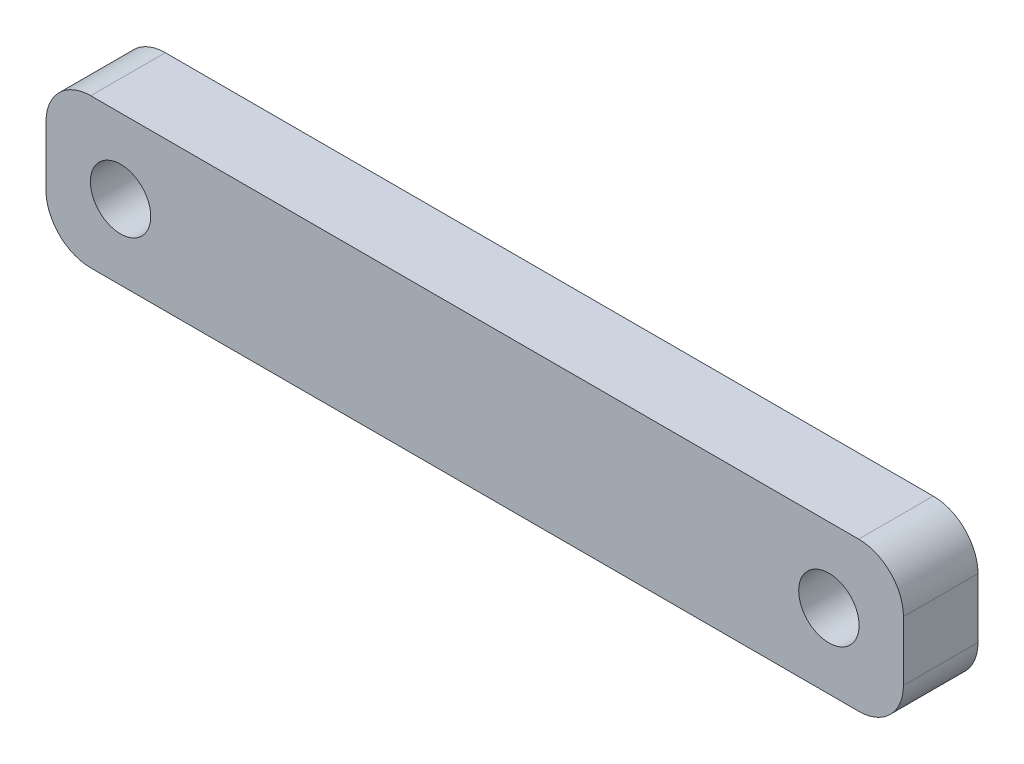
ISO-10303-21;
HEADER;
FILE_DESCRIPTION(('STEP AP214'),'2;1');
FILE_NAME('part.step','',(''),(''),'','','');
FILE_SCHEMA(('AUTOMOTIVE_DESIGN { 1 0 10303 214 1 1 1 1 }'));
ENDSEC;
DATA;
#1=APPLICATION_CONTEXT('core data for automotive mechanical design processes');
#2=APPLICATION_PROTOCOL_DEFINITION('international standard','automotive_design',2000,#1);
#3=PRODUCT_CONTEXT('',#1,'mechanical');
#4=PRODUCT('Part','Part','',(#3));
#5=PRODUCT_RELATED_PRODUCT_CATEGORY('part','',(#4));
#6=PRODUCT_DEFINITION_FORMATION('','',#4);
#7=PRODUCT_DEFINITION_CONTEXT('part definition',#1,'design');
#8=PRODUCT_DEFINITION('design','',#6,#7);
#9=PRODUCT_DEFINITION_SHAPE('','',#8);
#10=(LENGTH_UNIT() NAMED_UNIT(*) SI_UNIT(.MILLI.,.METRE.));
#11=(NAMED_UNIT(*) PLANE_ANGLE_UNIT() SI_UNIT($,.RADIAN.));
#12=(NAMED_UNIT(*) SI_UNIT($,.STERADIAN.) SOLID_ANGLE_UNIT());
#13=UNCERTAINTY_MEASURE_WITH_UNIT(LENGTH_MEASURE(1.E-05),#10,'distance_accuracy_value','');
#14=(GEOMETRIC_REPRESENTATION_CONTEXT(3) GLOBAL_UNCERTAINTY_ASSIGNED_CONTEXT((#13)) GLOBAL_UNIT_ASSIGNED_CONTEXT((#10,
#11,#12)) REPRESENTATION_CONTEXT('',''));
#15=CARTESIAN_POINT('',(0.,0.,0.));
#16=DIRECTION('',(0.,0.,1.));
#17=DIRECTION('',(1.,0.,0.));
#18=AXIS2_PLACEMENT_3D('',#15,#16,#17);
#19=CARTESIAN_POINT('',(0.,10.,0.));
#20=DIRECTION('',(1.,0.,0.));
#21=DIRECTION('',(0.,0.,-1.));
#22=AXIS2_PLACEMENT_3D('',#19,#20,#21);
#23=PLANE('',#22);
#24=DIRECTION('',(0.,-1.,0.));
#25=VECTOR('',#24,1.);
#26=CARTESIAN_POINT('',(0.,10.,-5.));
#27=LINE('',#26,#25);
#28=CARTESIAN_POINT('',(0.,7.,-5.));
#29=VERTEX_POINT('',#28);
#30=CARTESIAN_POINT('',(0.,3.,-5.));
#31=VERTEX_POINT('',#30);
#32=EDGE_CURVE('E185',#29,#31,#27,.T.);
#33=ORIENTED_EDGE('',*,*,#32,.T.);
#34=DIRECTION('',(0.,0.,1.));
#35=VECTOR('',#34,1.);
#36=CARTESIAN_POINT('',(0.,3.,0.));
#37=LINE('',#36,#35);
#38=CARTESIAN_POINT('',(0.,3.,0.));
#39=VERTEX_POINT('',#38);
#40=EDGE_CURVE('E132',#31,#39,#37,.T.);
#41=ORIENTED_EDGE('',*,*,#40,.T.);
#42=DIRECTION('',(0.,-1.,0.));
#43=VECTOR('',#42,1.);
#44=CARTESIAN_POINT('',(0.,10.,0.));
#45=LINE('',#44,#43);
#46=CARTESIAN_POINT('',(0.,7.,0.));
#47=VERTEX_POINT('',#46);
#48=EDGE_CURVE('E115',#47,#39,#45,.T.);
#49=ORIENTED_EDGE('',*,*,#48,.F.);
#50=DIRECTION('',(0.,0.,1.));
#51=VECTOR('',#50,1.);
#52=CARTESIAN_POINT('',(0.,7.,0.));
#53=LINE('',#52,#51);
#54=EDGE_CURVE('E129',#47,#29,#53,.F.);
#55=ORIENTED_EDGE('',*,*,#54,.T.);
#56=EDGE_LOOP('',(#33,#41,#49,#55));
#57=FACE_BOUND('',#56,.T.);
#58=ADVANCED_FACE('F45',(#57),#23,.F.);
#59=CARTESIAN_POINT('',(0.,10.,0.));
#60=DIRECTION('',(0.,0.,-1.));
#61=DIRECTION('',(-1.,0.,0.));
#62=AXIS2_PLACEMENT_3D('',#59,#60,#61);
#63=PLANE('',#62);
#64=CARTESIAN_POINT('',(52.5,5.,0.));
#65=DIRECTION('',(0.,0.,-1.));
#66=DIRECTION('',(-1.,0.,0.));
#67=AXIS2_PLACEMENT_3D('',#64,#65,#66);
#68=CIRCLE('',#67,2.025);
#69=CARTESIAN_POINT('',(50.475,5.,0.));
#70=VERTEX_POINT('',#69);
#71=EDGE_CURVE('E199',#70,#70,#68,.T.);
#72=ORIENTED_EDGE('',*,*,#71,.T.);
#73=EDGE_LOOP('',(#72));
#74=FACE_BOUND('',#73,.T.);
#75=CARTESIAN_POINT('',(5.,5.,0.));
#76=DIRECTION('',(0.,0.,-1.));
#77=DIRECTION('',(-1.,0.,0.));
#78=AXIS2_PLACEMENT_3D('',#75,#76,#77);
#79=CIRCLE('',#78,2.025);
#80=CARTESIAN_POINT('',(2.975,5.,0.));
#81=VERTEX_POINT('',#80);
#82=EDGE_CURVE('E205',#81,#81,#79,.T.);
#83=ORIENTED_EDGE('',*,*,#82,.T.);
#84=EDGE_LOOP('',(#83));
#85=FACE_BOUND('',#84,.T.);
#86=ORIENTED_EDGE('',*,*,#48,.T.);
#87=CARTESIAN_POINT('',(3.,3.,0.));
#88=DIRECTION('',(0.,0.,-1.));
#89=DIRECTION('',(-1.,0.,0.));
#90=AXIS2_PLACEMENT_3D('',#87,#88,#89);
#91=CIRCLE('',#90,3.);
#92=CARTESIAN_POINT('',(3.,0.,0.));
#93=VERTEX_POINT('',#92);
#94=EDGE_CURVE('E123',#39,#93,#91,.F.);
#95=ORIENTED_EDGE('',*,*,#94,.T.);
#96=DIRECTION('',(1.,0.,0.));
#97=VECTOR('',#96,1.);
#98=CARTESIAN_POINT('',(0.,0.,0.));
#99=LINE('',#98,#97);
#100=CARTESIAN_POINT('',(54.5,0.,0.));
#101=VERTEX_POINT('',#100);
#102=EDGE_CURVE('E195',#93,#101,#99,.T.);
#103=ORIENTED_EDGE('',*,*,#102,.T.);
#104=CARTESIAN_POINT('',(54.5,3.,0.));
#105=DIRECTION('',(0.,0.,-1.));
#106=DIRECTION('',(-1.,0.,0.));
#107=AXIS2_PLACEMENT_3D('',#104,#105,#106);
#108=CIRCLE('',#107,3.);
#109=CARTESIAN_POINT('',(57.5,3.,0.));
#110=VERTEX_POINT('',#109);
#111=EDGE_CURVE('E142',#101,#110,#108,.F.);
#112=ORIENTED_EDGE('',*,*,#111,.T.);
#113=DIRECTION('',(0.,-1.,0.));
#114=VECTOR('',#113,1.);
#115=CARTESIAN_POINT('',(57.5,10.,0.));
#116=LINE('',#115,#114);
#117=CARTESIAN_POINT('',(57.5,7.,0.));
#118=VERTEX_POINT('',#117);
#119=EDGE_CURVE('E134',#118,#110,#116,.T.);
#120=ORIENTED_EDGE('',*,*,#119,.F.);
#121=CARTESIAN_POINT('',(54.5,7.,0.));
#122=DIRECTION('',(0.,0.,-1.));
#123=DIRECTION('',(-1.,0.,0.));
#124=AXIS2_PLACEMENT_3D('',#121,#122,#123);
#125=CIRCLE('',#124,3.);
#126=CARTESIAN_POINT('',(54.5,10.,0.));
#127=VERTEX_POINT('',#126);
#128=EDGE_CURVE('E124',#118,#127,#125,.F.);
#129=ORIENTED_EDGE('',*,*,#128,.T.);
#130=DIRECTION('',(1.,0.,0.));
#131=VECTOR('',#130,1.);
#132=CARTESIAN_POINT('',(0.,10.,0.));
#133=LINE('',#132,#131);
#134=CARTESIAN_POINT('',(3.,10.,0.));
#135=VERTEX_POINT('',#134);
#136=EDGE_CURVE('E117',#135,#127,#133,.T.);
#137=ORIENTED_EDGE('',*,*,#136,.F.);
#138=CARTESIAN_POINT('',(3.,7.,0.));
#139=DIRECTION('',(0.,0.,-1.));
#140=DIRECTION('',(-1.,0.,0.));
#141=AXIS2_PLACEMENT_3D('',#138,#139,#140);
#142=CIRCLE('',#141,3.);
#143=EDGE_CURVE('E112',#135,#47,#142,.F.);
#144=ORIENTED_EDGE('',*,*,#143,.T.);
#145=EDGE_LOOP('',(#86,#95,#103,#112,#120,#129,#137,#144));
#146=FACE_BOUND('',#145,.T.);
#147=ADVANCED_FACE('F114',(#74,#85,#146),#63,.F.);
#148=CARTESIAN_POINT('',(57.5,10.,0.));
#149=DIRECTION('',(-1.,0.,0.));
#150=DIRECTION('',(0.,0.,1.));
#151=AXIS2_PLACEMENT_3D('',#148,#149,#150);
#152=PLANE('',#151);
#153=DIRECTION('',(0.,-1.,0.));
#154=VECTOR('',#153,1.);
#155=CARTESIAN_POINT('',(57.5,10.,-5.));
#156=LINE('',#155,#154);
#157=CARTESIAN_POINT('',(57.5,7.,-5.));
#158=VERTEX_POINT('',#157);
#159=CARTESIAN_POINT('',(57.5,3.,-5.));
#160=VERTEX_POINT('',#159);
#161=EDGE_CURVE('E177',#158,#160,#156,.T.);
#162=ORIENTED_EDGE('',*,*,#161,.F.);
#163=DIRECTION('',(0.,0.,-1.));
#164=VECTOR('',#163,1.);
#165=CARTESIAN_POINT('',(57.5,7.,0.));
#166=LINE('',#165,#164);
#167=EDGE_CURVE('E11',#158,#118,#166,.F.);
#168=ORIENTED_EDGE('',*,*,#167,.T.);
#169=ORIENTED_EDGE('',*,*,#119,.T.);
#170=DIRECTION('',(0.,0.,-1.));
#171=VECTOR('',#170,1.);
#172=CARTESIAN_POINT('',(57.5,3.,-5.));
#173=LINE('',#172,#171);
#174=EDGE_CURVE('E54',#110,#160,#173,.T.);
#175=ORIENTED_EDGE('',*,*,#174,.T.);
#176=EDGE_LOOP('',(#162,#168,#169,#175));
#177=FACE_BOUND('',#176,.T.);
#178=ADVANCED_FACE('F176',(#177),#152,.F.);
#179=CARTESIAN_POINT('',(0.,10.,-5.));
#180=DIRECTION('',(0.,0.,1.));
#181=DIRECTION('',(1.,0.,0.));
#182=AXIS2_PLACEMENT_3D('',#179,#180,#181);
#183=PLANE('',#182);
#184=CARTESIAN_POINT('',(52.5,5.,-5.));
#185=DIRECTION('',(0.,0.,-1.));
#186=DIRECTION('',(-1.,0.,0.));
#187=AXIS2_PLACEMENT_3D('',#184,#185,#186);
#188=CIRCLE('',#187,2.025);
#189=CARTESIAN_POINT('',(50.475,5.,-5.));
#190=VERTEX_POINT('',#189);
#191=EDGE_CURVE('E213',#190,#190,#188,.T.);
#192=ORIENTED_EDGE('',*,*,#191,.F.);
#193=EDGE_LOOP('',(#192));
#194=FACE_BOUND('',#193,.T.);
#195=CARTESIAN_POINT('',(5.,5.,-5.));
#196=DIRECTION('',(0.,0.,-1.));
#197=DIRECTION('',(-1.,0.,0.));
#198=AXIS2_PLACEMENT_3D('',#195,#196,#197);
#199=CIRCLE('',#198,2.025);
#200=CARTESIAN_POINT('',(2.975,5.,-5.));
#201=VERTEX_POINT('',#200);
#202=EDGE_CURVE('E209',#201,#201,#199,.T.);
#203=ORIENTED_EDGE('',*,*,#202,.F.);
#204=EDGE_LOOP('',(#203));
#205=FACE_BOUND('',#204,.T.);
#206=DIRECTION('',(-1.,0.,0.));
#207=VECTOR('',#206,1.);
#208=CARTESIAN_POINT('',(0.,0.,-5.));
#209=LINE('',#208,#207);
#210=CARTESIAN_POINT('',(54.5,0.,-5.));
#211=VERTEX_POINT('',#210);
#212=CARTESIAN_POINT('',(3.,0.,-5.));
#213=VERTEX_POINT('',#212);
#214=EDGE_CURVE('E192',#211,#213,#209,.T.);
#215=ORIENTED_EDGE('',*,*,#214,.T.);
#216=CARTESIAN_POINT('',(3.,3.,-5.));
#217=DIRECTION('',(0.,0.,1.));
#218=DIRECTION('',(1.,0.,0.));
#219=AXIS2_PLACEMENT_3D('',#216,#217,#218);
#220=CIRCLE('',#219,3.);
#221=EDGE_CURVE('E164',#213,#31,#220,.F.);
#222=ORIENTED_EDGE('',*,*,#221,.T.);
#223=ORIENTED_EDGE('',*,*,#32,.F.);
#224=CARTESIAN_POINT('',(3.,7.,-5.));
#225=DIRECTION('',(0.,0.,1.));
#226=DIRECTION('',(1.,0.,0.));
#227=AXIS2_PLACEMENT_3D('',#224,#225,#226);
#228=CIRCLE('',#227,3.);
#229=CARTESIAN_POINT('',(3.,10.,-5.));
#230=VERTEX_POINT('',#229);
#231=EDGE_CURVE('E138',#29,#230,#228,.F.);
#232=ORIENTED_EDGE('',*,*,#231,.T.);
#233=DIRECTION('',(-1.,0.,0.));
#234=VECTOR('',#233,1.);
#235=CARTESIAN_POINT('',(0.,10.,-5.));
#236=LINE('',#235,#234);
#237=CARTESIAN_POINT('',(54.5,10.,-5.));
#238=VERTEX_POINT('',#237);
#239=EDGE_CURVE('E189',#238,#230,#236,.T.);
#240=ORIENTED_EDGE('',*,*,#239,.F.);
#241=CARTESIAN_POINT('',(54.5,7.,-5.));
#242=DIRECTION('',(0.,0.,1.));
#243=DIRECTION('',(1.,0.,0.));
#244=AXIS2_PLACEMENT_3D('',#241,#242,#243);
#245=CIRCLE('',#244,3.);
#246=EDGE_CURVE('E69',#238,#158,#245,.F.);
#247=ORIENTED_EDGE('',*,*,#246,.T.);
#248=ORIENTED_EDGE('',*,*,#161,.T.);
#249=CARTESIAN_POINT('',(54.5,3.,-5.));
#250=DIRECTION('',(0.,0.,1.));
#251=DIRECTION('',(1.,0.,0.));
#252=AXIS2_PLACEMENT_3D('',#249,#250,#251);
#253=CIRCLE('',#252,3.);
#254=EDGE_CURVE('E61',#160,#211,#253,.F.);
#255=ORIENTED_EDGE('',*,*,#254,.T.);
#256=EDGE_LOOP('',(#215,#222,#223,#232,#240,#247,#248,#255));
#257=FACE_BOUND('',#256,.T.);
#258=ADVANCED_FACE('F182',(#194,#205,#257),#183,.F.);
#259=CARTESIAN_POINT('',(0.,10.,0.));
#260=DIRECTION('',(0.,-1.,0.));
#261=DIRECTION('',(0.,0.,-1.));
#262=AXIS2_PLACEMENT_3D('',#259,#260,#261);
#263=PLANE('',#262);
#264=ORIENTED_EDGE('',*,*,#239,.T.);
#265=DIRECTION('',(0.,0.,1.));
#266=VECTOR('',#265,1.);
#267=CARTESIAN_POINT('',(3.,10.,0.));
#268=LINE('',#267,#266);
#269=EDGE_CURVE('E171',#230,#135,#268,.T.);
#270=ORIENTED_EDGE('',*,*,#269,.T.);
#271=ORIENTED_EDGE('',*,*,#136,.T.);
#272=DIRECTION('',(0.,0.,-1.));
#273=VECTOR('',#272,1.);
#274=CARTESIAN_POINT('',(54.5,10.,0.));
#275=LINE('',#274,#273);
#276=EDGE_CURVE('E167',#127,#238,#275,.T.);
#277=ORIENTED_EDGE('',*,*,#276,.T.);
#278=EDGE_LOOP('',(#264,#270,#271,#277));
#279=FACE_BOUND('',#278,.T.);
#280=ADVANCED_FACE('F233',(#279),#263,.F.);
#281=CARTESIAN_POINT('',(0.,0.,0.));
#282=DIRECTION('',(0.,-1.,0.));
#283=DIRECTION('',(0.,0.,-1.));
#284=AXIS2_PLACEMENT_3D('',#281,#282,#283);
#285=PLANE('',#284);
#286=ORIENTED_EDGE('',*,*,#102,.F.);
#287=DIRECTION('',(0.,0.,1.));
#288=VECTOR('',#287,1.);
#289=CARTESIAN_POINT('',(3.,0.,-5.));
#290=LINE('',#289,#288);
#291=EDGE_CURVE('E155',#93,#213,#290,.F.);
#292=ORIENTED_EDGE('',*,*,#291,.T.);
#293=ORIENTED_EDGE('',*,*,#214,.F.);
#294=DIRECTION('',(0.,0.,-1.));
#295=VECTOR('',#294,1.);
#296=CARTESIAN_POINT('',(54.5,0.,0.));
#297=LINE('',#296,#295);
#298=EDGE_CURVE('E152',#211,#101,#297,.F.);
#299=ORIENTED_EDGE('',*,*,#298,.T.);
#300=EDGE_LOOP('',(#286,#292,#293,#299));
#301=FACE_BOUND('',#300,.T.);
#302=ADVANCED_FACE('F238',(#301),#285,.T.);
#303=CARTESIAN_POINT('',(5.,5.,0.));
#304=DIRECTION('',(0.,0.,-1.));
#305=DIRECTION('',(-1.,0.,0.));
#306=AXIS2_PLACEMENT_3D('',#303,#304,#305);
#307=CYLINDRICAL_SURFACE('',#306,2.025);
#308=ORIENTED_EDGE('',*,*,#82,.F.);
#309=EDGE_LOOP('',(#308));
#310=FACE_BOUND('',#309,.T.);
#311=ORIENTED_EDGE('',*,*,#202,.T.);
#312=EDGE_LOOP('',(#311));
#313=FACE_BOUND('',#312,.T.);
#314=ADVANCED_FACE('F227',(#310,#313),#307,.F.);
#315=CARTESIAN_POINT('',(52.5,5.,0.));
#316=DIRECTION('',(0.,0.,-1.));
#317=DIRECTION('',(-1.,0.,0.));
#318=AXIS2_PLACEMENT_3D('',#315,#316,#317);
#319=CYLINDRICAL_SURFACE('',#318,2.025);
#320=ORIENTED_EDGE('',*,*,#71,.F.);
#321=EDGE_LOOP('',(#320));
#322=FACE_BOUND('',#321,.T.);
#323=ORIENTED_EDGE('',*,*,#191,.T.);
#324=EDGE_LOOP('',(#323));
#325=FACE_BOUND('',#324,.T.);
#326=ADVANCED_FACE('F223',(#322,#325),#319,.F.);
#327=CARTESIAN_POINT('',(3.,3.,0.));
#328=DIRECTION('',(0.,0.,-1.));
#329=DIRECTION('',(-1.,0.,0.));
#330=AXIS2_PLACEMENT_3D('',#327,#328,#329);
#331=CYLINDRICAL_SURFACE('',#330,3.);
#332=ORIENTED_EDGE('',*,*,#221,.F.);
#333=ORIENTED_EDGE('',*,*,#291,.F.);
#334=ORIENTED_EDGE('',*,*,#94,.F.);
#335=ORIENTED_EDGE('',*,*,#40,.F.);
#336=EDGE_LOOP('',(#332,#333,#334,#335));
#337=FACE_BOUND('',#336,.T.);
#338=ADVANCED_FACE('F226',(#337),#331,.T.);
#339=CARTESIAN_POINT('',(3.,7.,0.));
#340=DIRECTION('',(0.,0.,1.));
#341=DIRECTION('',(1.,0.,0.));
#342=AXIS2_PLACEMENT_3D('',#339,#340,#341);
#343=CYLINDRICAL_SURFACE('',#342,3.);
#344=ORIENTED_EDGE('',*,*,#231,.F.);
#345=ORIENTED_EDGE('',*,*,#54,.F.);
#346=ORIENTED_EDGE('',*,*,#143,.F.);
#347=ORIENTED_EDGE('',*,*,#269,.F.);
#348=EDGE_LOOP('',(#344,#345,#346,#347));
#349=FACE_BOUND('',#348,.T.);
#350=ADVANCED_FACE('F137',(#349),#343,.T.);
#351=CARTESIAN_POINT('',(54.5,7.,0.));
#352=DIRECTION('',(0.,0.,-1.));
#353=DIRECTION('',(-1.,0.,0.));
#354=AXIS2_PLACEMENT_3D('',#351,#352,#353);
#355=CYLINDRICAL_SURFACE('',#354,3.);
#356=ORIENTED_EDGE('',*,*,#128,.F.);
#357=ORIENTED_EDGE('',*,*,#167,.F.);
#358=ORIENTED_EDGE('',*,*,#246,.F.);
#359=ORIENTED_EDGE('',*,*,#276,.F.);
#360=EDGE_LOOP('',(#356,#357,#358,#359));
#361=FACE_BOUND('',#360,.T.);
#362=ADVANCED_FACE('F260',(#361),#355,.T.);
#363=CARTESIAN_POINT('',(54.5,3.,0.));
#364=DIRECTION('',(0.,0.,1.));
#365=DIRECTION('',(1.,0.,0.));
#366=AXIS2_PLACEMENT_3D('',#363,#364,#365);
#367=CYLINDRICAL_SURFACE('',#366,3.);
#368=ORIENTED_EDGE('',*,*,#111,.F.);
#369=ORIENTED_EDGE('',*,*,#298,.F.);
#370=ORIENTED_EDGE('',*,*,#254,.F.);
#371=ORIENTED_EDGE('',*,*,#174,.F.);
#372=EDGE_LOOP('',(#368,#369,#370,#371));
#373=FACE_BOUND('',#372,.T.);
#374=ADVANCED_FACE('F47',(#373),#367,.T.);
#375=CLOSED_SHELL('',(#58,#147,#178,#258,#280,#302,#314,#326,#338,#350,#362,#374));
#376=MANIFOLD_SOLID_BREP('B2',#375);
#377=ADVANCED_BREP_SHAPE_REPRESENTATION('',(#18,#376),#14);
#378=SHAPE_DEFINITION_REPRESENTATION(#9,#377);
ENDSEC;
END-ISO-10303-21;
